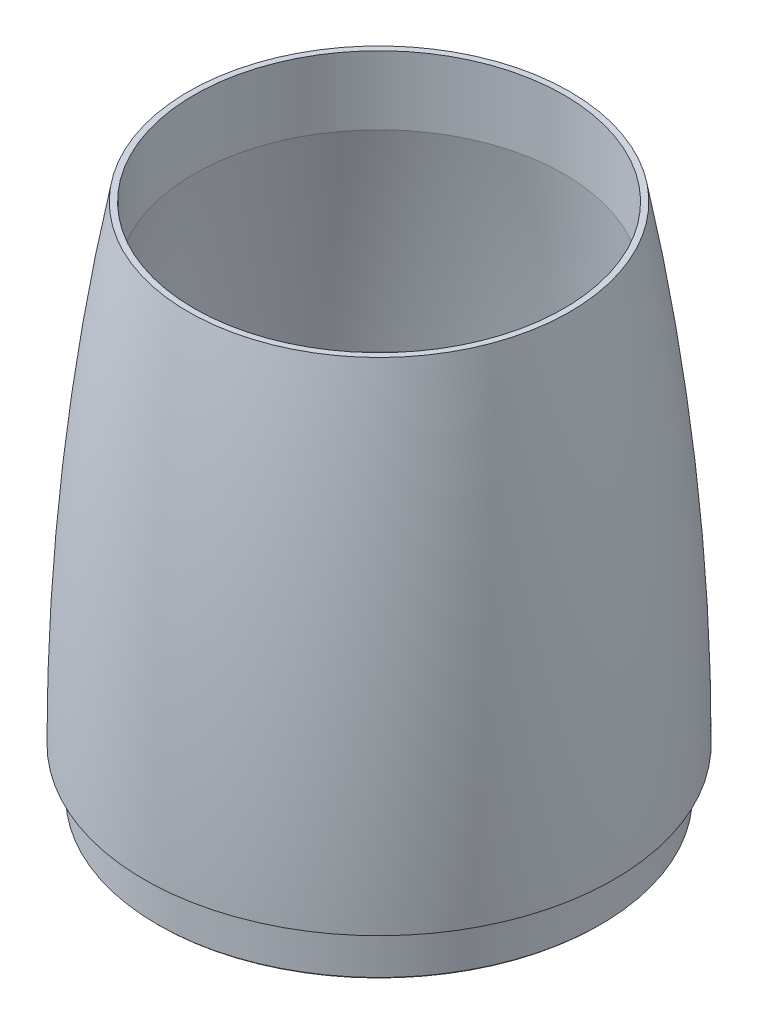
ISO-10303-21;
HEADER;
FILE_DESCRIPTION(('STEP AP214'),'2;1');
FILE_NAME('part.step','',(''),(''),'','','');
FILE_SCHEMA(('AUTOMOTIVE_DESIGN { 1 0 10303 214 1 1 1 1 }'));
ENDSEC;
DATA;
#1=APPLICATION_CONTEXT('core data for automotive mechanical design processes');
#2=APPLICATION_PROTOCOL_DEFINITION('international standard','automotive_design',2000,#1);
#3=PRODUCT_CONTEXT('',#1,'mechanical');
#4=PRODUCT('Part','Part','',(#3));
#5=PRODUCT_RELATED_PRODUCT_CATEGORY('part','',(#4));
#6=PRODUCT_DEFINITION_FORMATION('','',#4);
#7=PRODUCT_DEFINITION_CONTEXT('part definition',#1,'design');
#8=PRODUCT_DEFINITION('design','',#6,#7);
#9=PRODUCT_DEFINITION_SHAPE('','',#8);
#10=(LENGTH_UNIT() NAMED_UNIT(*) SI_UNIT(.MILLI.,.METRE.));
#11=(NAMED_UNIT(*) PLANE_ANGLE_UNIT() SI_UNIT($,.RADIAN.));
#12=(NAMED_UNIT(*) SI_UNIT($,.STERADIAN.) SOLID_ANGLE_UNIT());
#13=UNCERTAINTY_MEASURE_WITH_UNIT(LENGTH_MEASURE(1.E-05),#10,'distance_accuracy_value','');
#14=(GEOMETRIC_REPRESENTATION_CONTEXT(3) GLOBAL_UNCERTAINTY_ASSIGNED_CONTEXT((#13)) GLOBAL_UNIT_ASSIGNED_CONTEXT((#10,
#11,#12)) REPRESENTATION_CONTEXT('',''));
#15=CARTESIAN_POINT('',(0.,0.,0.));
#16=DIRECTION('',(0.,0.,1.));
#17=DIRECTION('',(1.,0.,0.));
#18=AXIS2_PLACEMENT_3D('',#15,#16,#17);
#19=CARTESIAN_POINT('',(0.,1.15603097727035E-13,0.));
#20=DIRECTION('',(0.,-1.,0.));
#21=DIRECTION('',(0.,0.,-1.));
#22=AXIS2_PLACEMENT_3D('',#19,#20,#21);
#23=DEGENERATE_TOROIDAL_SURFACE('',#22,390.416666666665,430.416666666665,.F.);
#24=CARTESIAN_POINT('',(0.,0.,0.));
#25=DIRECTION('',(0.,-1.,0.));
#26=DIRECTION('',(0.,0.,-1.));
#27=AXIS2_PLACEMENT_3D('',#24,#25,#26);
#28=CIRCLE('',#27,40.);
#29=CARTESIAN_POINT('',(0.,0.,-40.));
#30=VERTEX_POINT('',#29);
#31=EDGE_CURVE('E68',#30,#30,#28,.T.);
#32=ORIENTED_EDGE('',*,*,#31,.F.);
#33=EDGE_LOOP('',(#32));
#34=FACE_BOUND('',#33,.T.);
#35=CARTESIAN_POINT('',(0.,80.0000000000001,0.));
#36=DIRECTION('',(0.,-1.,0.));
#37=DIRECTION('',(0.,0.,-1.));
#38=AXIS2_PLACEMENT_3D('',#35,#36,#37);
#39=CIRCLE('',#38,32.5000000000001);
#40=CARTESIAN_POINT('',(0.,80.0000000000001,-32.5000000000001));
#41=VERTEX_POINT('',#40);
#42=EDGE_CURVE('E88',#41,#41,#39,.T.);
#43=ORIENTED_EDGE('',*,*,#42,.T.);
#44=EDGE_LOOP('',(#43));
#45=FACE_BOUND('',#44,.T.);
#46=ADVANCED_FACE('F43',(#34,#45),#23,.F.);
#47=CARTESIAN_POINT('',(-40.,0.,0.));
#48=DIRECTION('',(0.,1.,0.));
#49=DIRECTION('',(0.,0.,1.));
#50=AXIS2_PLACEMENT_3D('',#47,#48,#49);
#51=PLANE('',#50);
#52=CARTESIAN_POINT('',(0.,0.,0.));
#53=DIRECTION('',(0.,-1.,0.));
#54=DIRECTION('',(0.,0.,-1.));
#55=AXIS2_PLACEMENT_3D('',#52,#53,#54);
#56=CIRCLE('',#55,37.75);
#57=CARTESIAN_POINT('',(0.,0.,-37.75));
#58=VERTEX_POINT('',#57);
#59=EDGE_CURVE('E72',#58,#58,#56,.T.);
#60=ORIENTED_EDGE('',*,*,#59,.F.);
#61=EDGE_LOOP('',(#60));
#62=FACE_BOUND('',#61,.T.);
#63=ORIENTED_EDGE('',*,*,#31,.T.);
#64=EDGE_LOOP('',(#63));
#65=FACE_BOUND('',#64,.T.);
#66=ADVANCED_FACE('F124',(#62,#65),#51,.F.);
#67=CARTESIAN_POINT('',(0.,-1572.02612713965,0.));
#68=DIRECTION('',(0.,-1.,0.));
#69=DIRECTION('',(0.,0.,-1.));
#70=AXIS2_PLACEMENT_3D('',#67,#68,#69);
#71=CYLINDRICAL_SURFACE('',#70,37.75);
#72=CARTESIAN_POINT('',(0.,-7.75000000000015,0.));
#73=DIRECTION('',(0.,1.,0.));
#74=DIRECTION('',(0.,0.,1.));
#75=AXIS2_PLACEMENT_3D('',#72,#73,#74);
#76=CIRCLE('',#75,37.75);
#77=CARTESIAN_POINT('',(0.,-7.75000000000015,37.75));
#78=VERTEX_POINT('',#77);
#79=EDGE_CURVE('E52',#78,#78,#76,.T.);
#80=ORIENTED_EDGE('',*,*,#79,.T.);
#81=EDGE_LOOP('',(#80));
#82=FACE_BOUND('',#81,.T.);
#83=ORIENTED_EDGE('',*,*,#59,.T.);
#84=EDGE_LOOP('',(#83));
#85=FACE_BOUND('',#84,.T.);
#86=ADVANCED_FACE('F120',(#82,#85),#71,.T.);
#87=CARTESIAN_POINT('',(-37.75,-8.00000000000001,0.));
#88=DIRECTION('',(0.,1.,0.));
#89=DIRECTION('',(0.,0.,1.));
#90=AXIS2_PLACEMENT_3D('',#87,#88,#89);
#91=PLANE('',#90);
#92=CARTESIAN_POINT('',(0.,-8.00000000000001,0.));
#93=DIRECTION('',(0.,1.,0.));
#94=DIRECTION('',(0.,0.,1.));
#95=AXIS2_PLACEMENT_3D('',#92,#93,#94);
#96=CIRCLE('',#95,37.5000000000002);
#97=CARTESIAN_POINT('',(0.,-8.00000000000001,37.5000000000002));
#98=VERTEX_POINT('',#97);
#99=EDGE_CURVE('E57',#98,#98,#96,.F.);
#100=ORIENTED_EDGE('',*,*,#99,.T.);
#101=EDGE_LOOP('',(#100));
#102=FACE_BOUND('',#101,.T.);
#103=CARTESIAN_POINT('',(0.,-8.00000000000001,0.));
#104=DIRECTION('',(0.,1.,0.));
#105=DIRECTION('',(0.,0.,1.));
#106=AXIS2_PLACEMENT_3D('',#103,#104,#105);
#107=CIRCLE('',#106,36.);
#108=CARTESIAN_POINT('',(0.,-8.00000000000001,36.));
#109=VERTEX_POINT('',#108);
#110=EDGE_CURVE('E62',#109,#109,#107,.T.);
#111=ORIENTED_EDGE('',*,*,#110,.T.);
#112=EDGE_LOOP('',(#111));
#113=FACE_BOUND('',#112,.T.);
#114=ADVANCED_FACE('F115',(#102,#113),#91,.F.);
#115=CARTESIAN_POINT('',(0.,-1572.02612713965,0.));
#116=DIRECTION('',(0.,-1.,0.));
#117=DIRECTION('',(0.,0.,-1.));
#118=AXIS2_PLACEMENT_3D('',#115,#116,#117);
#119=CYLINDRICAL_SURFACE('',#118,35.75);
#120=CARTESIAN_POINT('',(0.,-7.74999999999992,0.));
#121=DIRECTION('',(0.,1.,0.));
#122=DIRECTION('',(0.,0.,1.));
#123=AXIS2_PLACEMENT_3D('',#120,#121,#122);
#124=CIRCLE('',#123,35.75);
#125=CARTESIAN_POINT('',(0.,-7.74999999999992,35.75));
#126=VERTEX_POINT('',#125);
#127=EDGE_CURVE('E10',#126,#126,#124,.F.);
#128=ORIENTED_EDGE('',*,*,#127,.T.);
#129=EDGE_LOOP('',(#128));
#130=FACE_BOUND('',#129,.T.);
#131=CARTESIAN_POINT('',(0.,32.6646470464131,0.));
#132=DIRECTION('',(0.,-1.,0.));
#133=DIRECTION('',(0.,0.,-1.));
#134=AXIS2_PLACEMENT_3D('',#131,#132,#133);
#135=CIRCLE('',#134,35.75);
#136=CARTESIAN_POINT('',(0.,32.6646470464131,-35.75));
#137=VERTEX_POINT('',#136);
#138=EDGE_CURVE('E76',#137,#137,#135,.T.);
#139=ORIENTED_EDGE('',*,*,#138,.F.);
#140=EDGE_LOOP('',(#139));
#141=FACE_BOUND('',#140,.T.);
#142=ADVANCED_FACE('F110',(#130,#141),#119,.F.);
#143=CARTESIAN_POINT('',(0.,1.15603097727035E-13,0.));
#144=DIRECTION('',(0.,-1.,0.));
#145=DIRECTION('',(0.,0.,-1.));
#146=AXIS2_PLACEMENT_3D('',#143,#144,#145);
#147=DEGENERATE_TOROIDAL_SURFACE('',#146,390.416666666665,427.416666666665,.F.);
#148=CARTESIAN_POINT('',(0.,68.3471530740918,0.));
#149=DIRECTION('',(0.,-1.,0.));
#150=DIRECTION('',(0.,0.,-1.));
#151=AXIS2_PLACEMENT_3D('',#148,#149,#150);
#152=CIRCLE('',#151,31.5000000000001);
#153=CARTESIAN_POINT('',(0.,68.3471530740918,-31.5000000000001));
#154=VERTEX_POINT('',#153);
#155=EDGE_CURVE('E80',#154,#154,#152,.T.);
#156=ORIENTED_EDGE('',*,*,#155,.F.);
#157=EDGE_LOOP('',(#156));
#158=FACE_BOUND('',#157,.T.);
#159=ORIENTED_EDGE('',*,*,#138,.T.);
#160=EDGE_LOOP('',(#159));
#161=FACE_BOUND('',#160,.T.);
#162=ADVANCED_FACE('F104',(#158,#161),#147,.T.);
#163=CARTESIAN_POINT('',(0.,-1572.02612713965,0.));
#164=DIRECTION('',(0.,-1.,0.));
#165=DIRECTION('',(0.,0.,-1.));
#166=AXIS2_PLACEMENT_3D('',#163,#164,#165);
#167=CYLINDRICAL_SURFACE('',#166,31.5000000000001);
#168=CARTESIAN_POINT('',(0.,80.0000000000001,0.));
#169=DIRECTION('',(0.,-1.,0.));
#170=DIRECTION('',(0.,0.,-1.));
#171=AXIS2_PLACEMENT_3D('',#168,#169,#170);
#172=CIRCLE('',#171,31.5000000000001);
#173=CARTESIAN_POINT('',(0.,80.0000000000001,-31.5000000000001));
#174=VERTEX_POINT('',#173);
#175=EDGE_CURVE('E84',#174,#174,#172,.T.);
#176=ORIENTED_EDGE('',*,*,#175,.F.);
#177=EDGE_LOOP('',(#176));
#178=FACE_BOUND('',#177,.T.);
#179=ORIENTED_EDGE('',*,*,#155,.T.);
#180=EDGE_LOOP('',(#179));
#181=FACE_BOUND('',#180,.T.);
#182=ADVANCED_FACE('F98',(#178,#181),#167,.F.);
#183=CARTESIAN_POINT('',(-32.5000000000001,80.,0.));
#184=DIRECTION('',(0.,-1.,0.));
#185=DIRECTION('',(0.,0.,-1.));
#186=AXIS2_PLACEMENT_3D('',#183,#184,#185);
#187=PLANE('',#186);
#188=ORIENTED_EDGE('',*,*,#42,.F.);
#189=EDGE_LOOP('',(#188));
#190=FACE_BOUND('',#189,.T.);
#191=ORIENTED_EDGE('',*,*,#175,.T.);
#192=EDGE_LOOP('',(#191));
#193=FACE_BOUND('',#192,.T.);
#194=ADVANCED_FACE('F94',(#190,#193),#187,.F.);
#195=CARTESIAN_POINT('',(0.,-8.00000000000001,0.));
#196=DIRECTION('',(0.,1.,0.));
#197=DIRECTION('',(0.,0.,1.));
#198=AXIS2_PLACEMENT_3D('',#195,#196,#197);
#199=CONICAL_SURFACE('',#198,37.5000000000002,0.785398163397407);
#200=ORIENTED_EDGE('',*,*,#79,.F.);
#201=EDGE_LOOP('',(#200));
#202=FACE_BOUND('',#201,.T.);
#203=ORIENTED_EDGE('',*,*,#99,.F.);
#204=EDGE_LOOP('',(#203));
#205=FACE_BOUND('',#204,.T.);
#206=ADVANCED_FACE('F97',(#202,#205),#199,.T.);
#207=CARTESIAN_POINT('',(0.,-7.74999999999992,0.));
#208=DIRECTION('',(0.,-1.,0.));
#209=DIRECTION('',(0.,0.,-1.));
#210=AXIS2_PLACEMENT_3D('',#207,#208,#209);
#211=CONICAL_SURFACE('',#210,35.75,0.785398163397254);
#212=ORIENTED_EDGE('',*,*,#110,.F.);
#213=EDGE_LOOP('',(#212));
#214=FACE_BOUND('',#213,.T.);
#215=ORIENTED_EDGE('',*,*,#127,.F.);
#216=EDGE_LOOP('',(#215));
#217=FACE_BOUND('',#216,.T.);
#218=ADVANCED_FACE('F46',(#214,#217),#211,.F.);
#219=CLOSED_SHELL('',(#46,#66,#86,#114,#142,#162,#182,#194,#206,#218));
#220=MANIFOLD_SOLID_BREP('B2',#219);
#221=ADVANCED_BREP_SHAPE_REPRESENTATION('',(#18,#220),#14);
#222=SHAPE_DEFINITION_REPRESENTATION(#9,#221);
ENDSEC;
END-ISO-10303-21;
